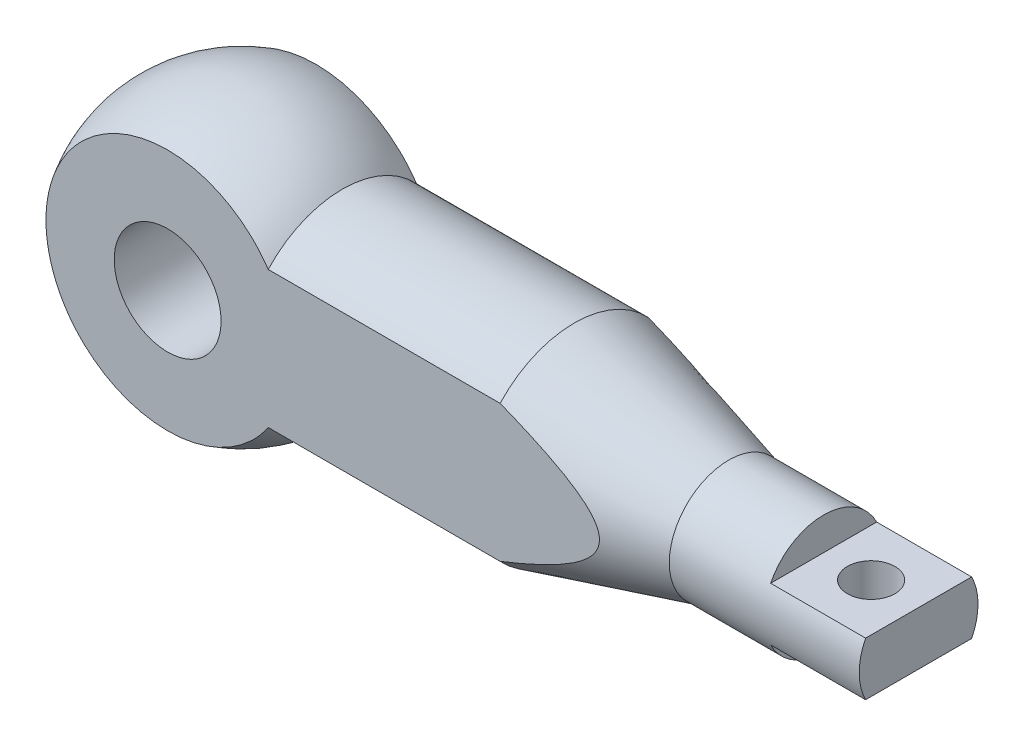
ISO-10303-21;
HEADER;
FILE_DESCRIPTION(('STEP AP214'),'2;1');
FILE_NAME('part.step','',(''),(''),'','','');
FILE_SCHEMA(('AUTOMOTIVE_DESIGN { 1 0 10303 214 1 1 1 1 }'));
ENDSEC;
DATA;
#1=APPLICATION_CONTEXT('core data for automotive mechanical design processes');
#2=APPLICATION_PROTOCOL_DEFINITION('international standard','automotive_design',2000,#1);
#3=PRODUCT_CONTEXT('',#1,'mechanical');
#4=PRODUCT('Part','Part','',(#3));
#5=PRODUCT_RELATED_PRODUCT_CATEGORY('part','',(#4));
#6=PRODUCT_DEFINITION_FORMATION('','',#4);
#7=PRODUCT_DEFINITION_CONTEXT('part definition',#1,'design');
#8=PRODUCT_DEFINITION('design','',#6,#7);
#9=PRODUCT_DEFINITION_SHAPE('','',#8);
#10=(LENGTH_UNIT() NAMED_UNIT(*) SI_UNIT(.MILLI.,.METRE.));
#11=(NAMED_UNIT(*) PLANE_ANGLE_UNIT() SI_UNIT($,.RADIAN.));
#12=(NAMED_UNIT(*) SI_UNIT($,.STERADIAN.) SOLID_ANGLE_UNIT());
#13=UNCERTAINTY_MEASURE_WITH_UNIT(LENGTH_MEASURE(1.E-05),#10,'distance_accuracy_value','');
#14=(GEOMETRIC_REPRESENTATION_CONTEXT(3) GLOBAL_UNCERTAINTY_ASSIGNED_CONTEXT((#13)) GLOBAL_UNIT_ASSIGNED_CONTEXT((#10,
#11,#12)) REPRESENTATION_CONTEXT('',''));
#15=CARTESIAN_POINT('',(0.,0.,0.));
#16=DIRECTION('',(0.,0.,1.));
#17=DIRECTION('',(1.,0.,0.));
#18=AXIS2_PLACEMENT_3D('',#15,#16,#17);
#19=CARTESIAN_POINT('',(-38.1,0.,0.));
#20=DIRECTION('',(-1.,0.,0.));
#21=DIRECTION('',(0.,0.,1.));
#22=AXIS2_PLACEMENT_3D('',#19,#20,#21);
#23=CYLINDRICAL_SURFACE('',#22,26.9875);
#24=CARTESIAN_POINT('',(88.9,0.,0.));
#25=DIRECTION('',(-1.,0.,0.));
#26=DIRECTION('',(0.,0.,1.));
#27=AXIS2_PLACEMENT_3D('',#24,#25,#26);
#28=CIRCLE('',#27,26.9875);
#29=CARTESIAN_POINT('',(88.9,-18.2976150765612,-19.8374));
#30=VERTEX_POINT('',#29);
#31=CARTESIAN_POINT('',(88.9,-18.2976150765612,19.8374));
#32=VERTEX_POINT('',#31);
#33=EDGE_CURVE('E183',#30,#32,#28,.T.);
#34=ORIENTED_EDGE('',*,*,#33,.T.);
#35=DIRECTION('',(-1.,0.,0.));
#36=VECTOR('',#35,1.);
#37=CARTESIAN_POINT('',(-38.1,-18.2976150765612,19.8374));
#38=LINE('',#37,#36);
#39=CARTESIAN_POINT('',(26.8939555244297,-18.2976150765612,19.8374));
#40=VERTEX_POINT('',#39);
#41=EDGE_CURVE('E168',#32,#40,#38,.T.);
#42=ORIENTED_EDGE('',*,*,#41,.T.);
#43=CARTESIAN_POINT('',(26.8939555244297,0.,0.));
#44=DIRECTION('',(-1.,0.,0.));
#45=DIRECTION('',(0.,0.,1.));
#46=AXIS2_PLACEMENT_3D('',#43,#44,#45);
#47=CIRCLE('',#46,26.9875);
#48=CARTESIAN_POINT('',(26.8939555244297,-18.2976150765612,-19.8374));
#49=VERTEX_POINT('',#48);
#50=EDGE_CURVE('E188',#49,#40,#47,.T.);
#51=ORIENTED_EDGE('',*,*,#50,.F.);
#52=DIRECTION('',(-1.,0.,0.));
#53=VECTOR('',#52,1.);
#54=CARTESIAN_POINT('',(-38.1,-18.2976150765612,-19.8374));
#55=LINE('',#54,#53);
#56=EDGE_CURVE('E134',#49,#30,#55,.F.);
#57=ORIENTED_EDGE('',*,*,#56,.T.);
#58=EDGE_LOOP('',(#34,#42,#51,#57));
#59=FACE_BOUND('',#58,.T.);
#60=ADVANCED_FACE('F39',(#59),#23,.T.);
#61=CARTESIAN_POINT('',(0.,0.,0.));
#62=DIRECTION('',(-1.,0.,0.));
#63=DIRECTION('',(0.,1.,0.));
#64=AXIS2_PLACEMENT_3D('',#61,#62,#63);
#65=SPHERICAL_SURFACE('',#64,38.1);
#66=CARTESIAN_POINT('',(0.,0.,19.8374));
#67=DIRECTION('',(0.,0.,-1.));
#68=DIRECTION('',(-1.,0.,0.));
#69=AXIS2_PLACEMENT_3D('',#66,#67,#68);
#70=CIRCLE('',#69,32.5282578881809);
#71=CARTESIAN_POINT('',(26.8939555244297,18.2976150765612,19.8374));
#72=VERTEX_POINT('',#71);
#73=EDGE_CURVE('E172',#40,#72,#70,.T.);
#74=ORIENTED_EDGE('',*,*,#73,.T.);
#75=CARTESIAN_POINT('',(26.8939555244297,18.2976150765612,-19.8374));
#76=VERTEX_POINT('',#75);
#77=EDGE_CURVE('E189',#72,#76,#47,.T.);
#78=ORIENTED_EDGE('',*,*,#77,.T.);
#79=CARTESIAN_POINT('',(0.,0.,-19.8374));
#80=DIRECTION('',(0.,0.,1.));
#81=DIRECTION('',(1.,0.,0.));
#82=AXIS2_PLACEMENT_3D('',#79,#80,#81);
#83=CIRCLE('',#82,32.5282578881809);
#84=EDGE_CURVE('E161',#76,#49,#83,.T.);
#85=ORIENTED_EDGE('',*,*,#84,.T.);
#86=ORIENTED_EDGE('',*,*,#50,.T.);
#87=EDGE_LOOP('',(#74,#78,#85,#86));
#88=FACE_BOUND('',#87,.T.);
#89=ADVANCED_FACE('F41',(#88),#65,.T.);
#90=ORIENTED_EDGE('',*,*,#77,.F.);
#91=DIRECTION('',(-1.,0.,0.));
#92=VECTOR('',#91,1.);
#93=CARTESIAN_POINT('',(-38.1,18.2976150765612,19.8374));
#94=LINE('',#93,#92);
#95=CARTESIAN_POINT('',(88.9,18.2976150765612,19.8374));
#96=VERTEX_POINT('',#95);
#97=EDGE_CURVE('E164',#72,#96,#94,.F.);
#98=ORIENTED_EDGE('',*,*,#97,.T.);
#99=CARTESIAN_POINT('',(88.9,18.2976150765612,-19.8374));
#100=VERTEX_POINT('',#99);
#101=EDGE_CURVE('E184',#96,#100,#28,.T.);
#102=ORIENTED_EDGE('',*,*,#101,.T.);
#103=DIRECTION('',(-1.,0.,0.));
#104=VECTOR('',#103,1.);
#105=CARTESIAN_POINT('',(-38.1,18.2976150765612,-19.8374));
#106=LINE('',#105,#104);
#107=EDGE_CURVE('E157',#100,#76,#106,.T.);
#108=ORIENTED_EDGE('',*,*,#107,.T.);
#109=EDGE_LOOP('',(#90,#98,#102,#108));
#110=FACE_BOUND('',#109,.T.);
#111=ADVANCED_FACE('F217',(#110),#23,.T.);
#112=CARTESIAN_POINT('',(130.175,0.,0.));
#113=DIRECTION('',(-1.,0.,0.));
#114=DIRECTION('',(0.,0.,1.));
#115=AXIS2_PLACEMENT_3D('',#112,#113,#114);
#116=CONICAL_SURFACE('',#115,15.875,0.26299473168092);
#117=ORIENTED_EDGE('',*,*,#101,.F.);
#118=CARTESIAN_POINT('',(20.9518327750712,40.7046436583915,19.8374));
#119=CARTESIAN_POINT('',(22.3822880112033,40.2762160310541,19.8374));
#120=CARTESIAN_POINT('',(23.8123887931812,39.8466054794505,19.8374));
#121=CARTESIAN_POINT('',(26.6718018677787,38.9847624838146,19.8374));
#122=CARTESIAN_POINT('',(28.1011141594613,38.5525300366742,19.8374));
#123=CARTESIAN_POINT('',(32.3878389375732,37.2514884503511,19.8374));
#124=CARTESIAN_POINT('',(35.2439441136354,36.3783635458465,19.8374));
#125=CARTESIAN_POINT('',(40.9559089761251,34.6166918853066,19.8374));
#126=CARTESIAN_POINT('',(43.8117623674174,33.728124703073,19.8374));
#127=CARTESIAN_POINT('',(49.5178336787221,31.933227844021,19.8374));
#128=CARTESIAN_POINT('',(52.3680517117119,31.0268985273545,19.8374));
#129=CARTESIAN_POINT('',(56.6450532283822,29.6479207090746,19.8374));
#130=CARTESIAN_POINT('',(58.0745945949615,29.183822937244,19.8374));
#131=CARTESIAN_POINT('',(60.9315001616513,28.2489775998761,19.8374));
#132=CARTESIAN_POINT('',(62.3588643663401,27.7782300483437,19.8374));
#133=CARTESIAN_POINT('',(65.2111284592841,26.8290296886149,19.8374));
#134=CARTESIAN_POINT('',(66.6360281899997,26.3505764066292,19.8374));
#135=CARTESIAN_POINT('',(69.4827892447898,25.3847151008392,19.8374));
#136=CARTESIAN_POINT('',(70.9046505759012,24.8973070977991,19.8374));
#137=CARTESIAN_POINT('',(73.7437370242878,23.9122704037833,19.8374));
#138=CARTESIAN_POINT('',(75.1609646587278,23.4146489773006,19.8374));
#139=CARTESIAN_POINT('',(77.9909598490674,22.4068092031187,19.8374));
#140=CARTESIAN_POINT('',(79.4037273565995,21.8965907193373,19.8374));
#141=CARTESIAN_POINT('',(82.2235099154354,20.8609400991814,19.8374));
#142=CARTESIAN_POINT('',(83.6305255757507,20.3355096237196,19.8374));
#143=CARTESIAN_POINT('',(86.4373705307564,19.2658304234761,19.8374));
#144=CARTESIAN_POINT('',(87.8372000441684,18.7215822753864,19.8374));
#145=CARTESIAN_POINT('',(89.9278190204788,17.88812143813,19.8374));
#146=CARTESIAN_POINT('',(90.6221825553122,17.6078668578627,19.8374));
#147=CARTESIAN_POINT('',(92.0081510283666,17.0405947158042,19.8374));
#148=CARTESIAN_POINT('',(92.6997559502168,16.7535771139479,19.8374));
#149=CARTESIAN_POINT('',(94.0799498527835,16.1717078330046,19.8374));
#150=CARTESIAN_POINT('',(94.7685377024964,15.8768534674391,19.8374));
#151=CARTESIAN_POINT('',(96.1418161088143,15.2782017153465,19.8374));
#152=CARTESIAN_POINT('',(96.826506694606,14.9744043958988,19.8374));
#153=CARTESIAN_POINT('',(98.1938912775238,14.3551270188827,19.8374));
#154=CARTESIAN_POINT('',(98.8765663791201,14.0396051479511,19.8374));
#155=CARTESIAN_POINT('',(100.236017767167,13.3961030382249,19.8374));
#156=CARTESIAN_POINT('',(100.912794200033,13.0681231097489,19.8374));
#157=CARTESIAN_POINT('',(102.258503164716,12.3973843563824,19.8374));
#158=CARTESIAN_POINT('',(102.92744010756,12.0546344054992,19.8374));
#159=CARTESIAN_POINT('',(104.255631907569,11.3508835683801,19.8374));
#160=CARTESIAN_POINT('',(104.914887756313,10.9898845683563,19.8374));
#161=CARTESIAN_POINT('',(105.896696575484,10.4296996364759,19.8374));
#162=CARTESIAN_POINT('',(106.224117160575,10.2390347238098,19.8374));
#163=CARTESIAN_POINT('',(106.875026806324,9.85111878468872,19.8374));
#164=CARTESIAN_POINT('',(107.198516022473,9.65386801987319,19.8374));
#165=CARTESIAN_POINT('',(107.841157678914,9.25166146325215,19.8374));
#166=CARTESIAN_POINT('',(108.160305150583,9.04669771389709,19.8374));
#167=CARTESIAN_POINT('',(108.792911291157,8.62816674400731,19.8374));
#168=CARTESIAN_POINT('',(109.106370148381,8.4145998090324,19.8374));
#169=CARTESIAN_POINT('',(109.7244851588,7.97879171290199,19.8374));
#170=CARTESIAN_POINT('',(110.029182056226,7.7566085520379,19.8374));
#171=CARTESIAN_POINT('',(110.629979198493,7.30074581685586,19.8374));
#172=CARTESIAN_POINT('',(110.92607796426,7.06706428296738,19.8374));
#173=CARTESIAN_POINT('',(111.506677233505,6.5866913533558,19.8374));
#174=CARTESIAN_POINT('',(111.791197876466,6.34002442470364,19.8374));
#175=CARTESIAN_POINT('',(112.345724591642,5.83097581756915,19.8374));
#176=CARTESIAN_POINT('',(112.615737825322,5.56860203043555,19.8374));
#177=CARTESIAN_POINT('',(113.053064261418,5.11218118633582,19.8374));
#178=CARTESIAN_POINT('',(113.225590788249,4.92313854145986,19.8374));
#179=CARTESIAN_POINT('',(113.55958306207,4.53539378464231,19.8374));
#180=CARTESIAN_POINT('',(113.72104655152,4.33668971523457,19.8374));
#181=CARTESIAN_POINT('',(114.029863463302,3.92901538589182,19.8374));
#182=CARTESIAN_POINT('',(114.17723986594,3.72006271741352,19.8374));
#183=CARTESIAN_POINT('',(114.45455992483,3.29102132050036,19.8374));
#184=CARTESIAN_POINT('',(114.584512188324,3.0709381648941,19.8374));
#185=CARTESIAN_POINT('',(114.863050014605,2.54258518506156,19.8374));
#186=CARTESIAN_POINT('',(115.003116649769,2.22962583138946,19.8374));
#187=CARTESIAN_POINT('',(115.174803276515,1.74680983308027,19.8374));
#188=CARTESIAN_POINT('',(115.225624690688,1.5836698107821,19.8374));
#189=CARTESIAN_POINT('',(115.313051723041,1.25365485149207,19.8374));
#190=CARTESIAN_POINT('',(115.349664640409,1.08678187891658,19.8374));
#191=CARTESIAN_POINT('',(115.40774906627,0.748697771908152,19.8374));
#192=CARTESIAN_POINT('',(115.429066893863,0.577460032370433,19.8374));
#193=CARTESIAN_POINT('',(115.455163649635,0.233723006787659,19.8374));
#194=CARTESIAN_POINT('',(115.459943325702,0.0612237781432779,19.8374));
#195=CARTESIAN_POINT('',(115.452773544956,-0.283453574307633,19.8374));
#196=CARTESIAN_POINT('',(115.440821229403,-0.45563163820848,19.8374));
#197=CARTESIAN_POINT('',(115.400652381859,-0.798072000406961,19.8374));
#198=CARTESIAN_POINT('',(115.372434350261,-0.968334120589447,19.8374));
#199=CARTESIAN_POINT('',(115.297929932552,-1.31888334059212,19.8374));
#200=CARTESIAN_POINT('',(115.250396003252,-1.49890444002497,19.8374));
#201=CARTESIAN_POINT('',(115.13934479418,-1.85399121944886,19.8374));
#202=CARTESIAN_POINT('',(115.075817272016,-2.02905364364299,19.8374));
#203=CARTESIAN_POINT('',(114.864066083077,-2.54594432502753,19.8374));
#204=CARTESIAN_POINT('',(114.694733789092,-2.87921648919213,19.8374));
#205=CARTESIAN_POINT('',(114.346061393135,-3.46877961594786,19.8374));
#206=CARTESIAN_POINT('',(114.172774857833,-3.7288006997069,19.8374));
#207=CARTESIAN_POINT('',(113.80427609307,-4.23302867430933,19.8374));
#208=CARTESIAN_POINT('',(113.609046919094,-4.47722311090607,19.8374));
#209=CARTESIAN_POINT('',(113.201497280748,-4.95181161569931,19.8374));
#210=CARTESIAN_POINT('',(112.989134718279,-5.18216910618381,19.8374));
#211=CARTESIAN_POINT('',(112.551619436085,-5.63014349050873,19.8374));
#212=CARTESIAN_POINT('',(112.326471179238,-5.8477647767478,19.8374));
#213=CARTESIAN_POINT('',(111.722142289409,-6.40472561891557,19.8374));
#214=CARTESIAN_POINT('',(111.334690246883,-6.7350714571458,19.8374));
#215=CARTESIAN_POINT('',(110.541149641254,-7.37272532117826,19.8374));
#216=CARTESIAN_POINT('',(110.135049612527,-7.680018859164,19.8374));
#217=CARTESIAN_POINT('',(109.308459107725,-8.27644955811056,19.8374));
#218=CARTESIAN_POINT('',(108.88793922125,-8.56554572540175,19.8374));
#219=CARTESIAN_POINT('',(108.036799729361,-9.12815109005102,19.8374));
#220=CARTESIAN_POINT('',(107.606182453688,-9.40166383393517,19.8374));
#221=CARTESIAN_POINT('',(106.734344856009,-9.93740659189574,19.8374));
#222=CARTESIAN_POINT('',(106.293075437358,-10.1995563878037,19.8374));
#223=CARTESIAN_POINT('',(105.404153101481,-10.7128126123674,19.8374));
#224=CARTESIAN_POINT('',(104.956499869179,-10.9639184934303,19.8374));
#225=CARTESIAN_POINT('',(104.056666480746,-11.4563351931817,19.8374));
#226=CARTESIAN_POINT('',(103.6044935453,-11.6976592415829,19.8374));
#227=CARTESIAN_POINT('',(102.695921406812,-12.1721539141663,19.8374));
#228=CARTESIAN_POINT('',(102.23952236389,-12.4053248456702,19.8374));
#229=CARTESIAN_POINT('',(101.240457770138,-12.9060200263773,19.8374));
#230=CARTESIAN_POINT('',(100.697092733259,-13.1721469977345,19.8374));
#231=CARTESIAN_POINT('',(99.6062715511252,-13.6958975581221,19.8374));
#232=CARTESIAN_POINT('',(99.058815293497,-13.9535209125222,19.8374));
#233=CARTESIAN_POINT('',(97.960425046685,-14.4614002609191,19.8374));
#234=CARTESIAN_POINT('',(97.4094906683158,-14.7116554120458,19.8374));
#235=CARTESIAN_POINT('',(96.3047164620008,-15.20567519761,19.8374));
#236=CARTESIAN_POINT('',(95.7508765958892,-15.4494397465317,19.8374));
#237=CARTESIAN_POINT('',(94.0851167772876,-16.1723878301356,19.8374));
#238=CARTESIAN_POINT('',(92.9694692441626,-16.6429906546282,19.8374));
#239=CARTESIAN_POINT('',(90.7307723006555,-17.5659678716515,19.8374));
#240=CARTESIAN_POINT('',(89.6077233066751,-18.01834327963,19.8374));
#241=CARTESIAN_POINT('',(87.3535381781714,-18.909133034052,19.8374));
#242=CARTESIAN_POINT('',(86.2223904242631,-19.3475179223098,19.8374));
#243=CARTESIAN_POINT('',(83.9553802743491,-20.2119374731611,19.8374));
#244=CARTESIAN_POINT('',(82.8195178205204,-20.63797198377,19.8374));
#245=CARTESIAN_POINT('',(80.5442620681217,-21.4795260158719,19.8374));
#246=CARTESIAN_POINT('',(79.4048698165167,-21.8950483722157,19.8374));
#247=CARTESIAN_POINT('',(77.1229023640993,-22.7172319737388,19.8374));
#248=CARTESIAN_POINT('',(75.9803271768636,-23.1238932566495,19.8374));
#249=CARTESIAN_POINT('',(73.6952782665065,-23.928605005331,19.8374));
#250=CARTESIAN_POINT('',(72.5528110726078,-24.3266740293214,19.8374));
#251=CARTESIAN_POINT('',(70.265596927264,-25.1162023568016,19.8374));
#252=CARTESIAN_POINT('',(69.1208499744986,-25.5076616564622,19.8374));
#253=CARTESIAN_POINT('',(65.6835347730332,-26.6734325448362,19.8374));
#254=CARTESIAN_POINT('',(63.3880297033256,-27.4390889323985,19.8374));
#255=CARTESIAN_POINT('',(58.7932728800853,-28.951613734197,19.8374));
#256=CARTESIAN_POINT('',(56.4940267533974,-29.6984992970269,19.8374));
#257=CARTESIAN_POINT('',(51.8908723820074,-31.1777750778548,19.8374));
#258=CARTESIAN_POINT('',(49.5869641209622,-31.9101652449421,19.8374));
#259=CARTESIAN_POINT('',(45.0919063358464,-33.3263900824596,19.8374));
#260=CARTESIAN_POINT('',(42.9009404757534,-34.010808510672,19.8374));
#261=CARTESIAN_POINT('',(38.5157624890983,-35.3708305608946,19.8374));
#262=CARTESIAN_POINT('',(36.3215497681468,-36.0464322650908,19.8374));
#263=CARTESIAN_POINT('',(31.9322991572362,-37.389592553908,19.8374));
#264=CARTESIAN_POINT('',(29.7372628452889,-38.0571562997385,19.8374));
#265=CARTESIAN_POINT('',(25.3457007673797,-39.3856071659004,19.8374));
#266=CARTESIAN_POINT('',(23.1491754388909,-40.0464957320033,19.8374));
#267=CARTESIAN_POINT('',(20.9518327750712,-40.7046436583915,19.8374));
#268=B_SPLINE_CURVE_WITH_KNOTS('',3,(#118,#119,#120,#121,#122,#123,#124,#125,#126,#127,#128,
#129,#130,#131,#132,#133,#134,#135,#136,#137,#138,#139,#140,#141,#142,#143,#144,#145,#146,#147,
#148,#149,#150,#151,#152,#153,#154,#155,#156,#157,#158,#159,#160,#161,#162,#163,#164,#165,#166,
#167,#168,#169,#170,#171,#172,#173,#174,#175,#176,#177,#178,#179,#180,#181,#182,#183,#184,#185,
#186,#187,#188,#189,#190,#191,#192,#193,#194,#195,#196,#197,#198,#199,#200,#201,#202,#203,#204,
#205,#206,#207,#208,#209,#210,#211,#212,#213,#214,#215,#216,#217,#218,#219,#220,#221,#222,#223,
#224,#225,#226,#227,#228,#229,#230,#231,#232,#233,#234,#235,#236,#237,#238,#239,#240,#241,#242,
#243,#244,#245,#246,#247,#248,#249,#250,#251,#252,#253,#254,#255,#256,#257,#258,#259,#260,#261,
#262,#263,#264,#265,#266,#267),.UNSPECIFIED.,.F.,.F.,(4,2,2,2,2,2,2,2,2,2,2,2,2,2,2,2,2,2,2,2,2,
2,2,2,2,2,2,2,2,2,2,2,2,2,2,2,2,2,2,2,2,2,2,2,2,2,2,2,2,2,2,2,2,2,2,2,2,2,2,2,2,2,2,2,2,2,2,2,2,
2,2,2,2,2,4),(0.,4.47970556078827,8.95941643306253,17.9191363202256,26.8917785071571,
35.864238949195,40.3731923541673,44.8821362643757,49.3913584749008,53.9005702308139,
58.4066788425654,62.912836153808,67.4185033046255,71.9240324955577,74.1703679090831,
76.4167166335288,78.6638456098343,80.9109577351363,83.1670445089677,85.4230751225682,
87.6777686852286,89.9322296785276,91.0688367857615,92.2053987920277,93.3431674026938,
94.4808982792329,95.6119787996814,96.7432527527954,97.8724665568785,99.0011177132891,
99.7685790825947,100.536196597714,101.302539725032,102.068502885522,103.093037268691,
103.605134787763,104.116968882797,104.633876345729,105.150760432734,105.667732842602,
106.184752922077,106.742475285016,107.300555729305,108.417505385936,109.353709965944,
110.290642533174,111.229951752686,112.168935095457,113.695153399041,115.222322994995,
116.752818090829,118.28296346875,119.822569818768,121.362252421553,122.899777979599,
124.43724551993,126.252265584101,128.067335686165,129.882612618933,131.697913456728,
135.330206767475,138.962297442905,142.601589293076,146.240925909613,149.87927039919,
153.517599393252,157.147067922385,160.776538554033,168.03591695874,175.288402713245,
182.540913935405,189.427025963687,196.314611696935,203.197509727571,210.078883572505),.UNSPECIFIED.);
#269=EDGE_CURVE('E11',#96,#32,#268,.T.);
#270=ORIENTED_EDGE('',*,*,#269,.T.);
#271=ORIENTED_EDGE('',*,*,#33,.F.);
#272=CARTESIAN_POINT('',(20.9518327750712,-40.7046436583915,-19.8374));
#273=CARTESIAN_POINT('',(22.3822880112033,-40.2762160310541,-19.8374));
#274=CARTESIAN_POINT('',(23.8123887931812,-39.8466054794505,-19.8374));
#275=CARTESIAN_POINT('',(26.6718018677786,-38.9847624838146,-19.8374));
#276=CARTESIAN_POINT('',(28.1011141594613,-38.5525300366742,-19.8374));
#277=CARTESIAN_POINT('',(32.3878389375732,-37.2514884503511,-19.8374));
#278=CARTESIAN_POINT('',(35.2439441136354,-36.3783635458465,-19.8374));
#279=CARTESIAN_POINT('',(40.9559089761251,-34.6166918853066,-19.8374));
#280=CARTESIAN_POINT('',(43.8117623674174,-33.728124703073,-19.8374));
#281=CARTESIAN_POINT('',(49.5178336787221,-31.933227844021,-19.8374));
#282=CARTESIAN_POINT('',(52.3680517117119,-31.0268985273545,-19.8374));
#283=CARTESIAN_POINT('',(56.6450532283822,-29.6479207090746,-19.8374));
#284=CARTESIAN_POINT('',(58.0745945949615,-29.183822937244,-19.8374));
#285=CARTESIAN_POINT('',(60.9315001616513,-28.2489775998761,-19.8374));
#286=CARTESIAN_POINT('',(62.35886436634,-27.7782300483437,-19.8374));
#287=CARTESIAN_POINT('',(65.2111284592841,-26.8290296886149,-19.8374));
#288=CARTESIAN_POINT('',(66.6360281899996,-26.3505764066292,-19.8374));
#289=CARTESIAN_POINT('',(69.4827892447897,-25.3847151008392,-19.8374));
#290=CARTESIAN_POINT('',(70.9046505759012,-24.8973070977991,-19.8374));
#291=CARTESIAN_POINT('',(73.7437370242878,-23.9122704037833,-19.8374));
#292=CARTESIAN_POINT('',(75.1609646587278,-23.4146489773006,-19.8374));
#293=CARTESIAN_POINT('',(77.9909598490674,-22.4068092031187,-19.8374));
#294=CARTESIAN_POINT('',(79.4037273565995,-21.8965907193373,-19.8374));
#295=CARTESIAN_POINT('',(82.2235099154354,-20.8609400991814,-19.8374));
#296=CARTESIAN_POINT('',(83.6305255757507,-20.3355096237196,-19.8374));
#297=CARTESIAN_POINT('',(86.4373705307564,-19.265830423476,-19.8374));
#298=CARTESIAN_POINT('',(87.8372000441684,-18.7215822753864,-19.8374));
#299=CARTESIAN_POINT('',(89.9278190204788,-17.88812143813,-19.8374));
#300=CARTESIAN_POINT('',(90.6221825553122,-17.6078668578627,-19.8374));
#301=CARTESIAN_POINT('',(92.0081510283666,-17.0405947158042,-19.8374));
#302=CARTESIAN_POINT('',(92.6997559502168,-16.7535771139479,-19.8374));
#303=CARTESIAN_POINT('',(94.0799498527835,-16.1717078330046,-19.8374));
#304=CARTESIAN_POINT('',(94.7685377024964,-15.8768534674391,-19.8374));
#305=CARTESIAN_POINT('',(96.1418161088143,-15.2782017153465,-19.8374));
#306=CARTESIAN_POINT('',(96.826506694606,-14.9744043958988,-19.8374));
#307=CARTESIAN_POINT('',(98.1938912775238,-14.3551270188827,-19.8374));
#308=CARTESIAN_POINT('',(98.8765663791201,-14.0396051479511,-19.8374));
#309=CARTESIAN_POINT('',(100.236017767167,-13.3961030382249,-19.8374));
#310=CARTESIAN_POINT('',(100.912794200033,-13.0681231097489,-19.8374));
#311=CARTESIAN_POINT('',(102.258503164716,-12.3973843563824,-19.8374));
#312=CARTESIAN_POINT('',(102.92744010756,-12.0546344054992,-19.8374));
#313=CARTESIAN_POINT('',(104.255631907569,-11.3508835683801,-19.8374));
#314=CARTESIAN_POINT('',(104.914887756313,-10.9898845683563,-19.8374));
#315=CARTESIAN_POINT('',(105.896696575484,-10.4296996364759,-19.8374));
#316=CARTESIAN_POINT('',(106.224117160575,-10.2390347238098,-19.8374));
#317=CARTESIAN_POINT('',(106.875026806324,-9.85111878468871,-19.8374));
#318=CARTESIAN_POINT('',(107.198516022473,-9.65386801987319,-19.8374));
#319=CARTESIAN_POINT('',(107.841157678914,-9.25166146325215,-19.8374));
#320=CARTESIAN_POINT('',(108.160305150583,-9.04669771389709,-19.8374));
#321=CARTESIAN_POINT('',(108.792911291157,-8.62816674400731,-19.8374));
#322=CARTESIAN_POINT('',(109.106370148381,-8.41459980903239,-19.8374));
#323=CARTESIAN_POINT('',(109.7244851588,-7.97879171290198,-19.8374));
#324=CARTESIAN_POINT('',(110.029182056226,-7.75660855203789,-19.8374));
#325=CARTESIAN_POINT('',(110.629979198493,-7.30074581685585,-19.8374));
#326=CARTESIAN_POINT('',(110.92607796426,-7.06706428296736,-19.8374));
#327=CARTESIAN_POINT('',(111.506677233505,-6.58669135335578,-19.8374));
#328=CARTESIAN_POINT('',(111.791197876466,-6.34002442470363,-19.8374));
#329=CARTESIAN_POINT('',(112.345724591642,-5.83097581756915,-19.8374));
#330=CARTESIAN_POINT('',(112.615737825322,-5.56860203043554,-19.8374));
#331=CARTESIAN_POINT('',(113.053064261418,-5.11218118633582,-19.8374));
#332=CARTESIAN_POINT('',(113.225590788249,-4.92313854145986,-19.8374));
#333=CARTESIAN_POINT('',(113.55958306207,-4.53539378464231,-19.8374));
#334=CARTESIAN_POINT('',(113.72104655152,-4.33668971523457,-19.8374));
#335=CARTESIAN_POINT('',(114.029863463302,-3.92901538589182,-19.8374));
#336=CARTESIAN_POINT('',(114.17723986594,-3.72006271741353,-19.8374));
#337=CARTESIAN_POINT('',(114.45455992483,-3.29102132050037,-19.8374));
#338=CARTESIAN_POINT('',(114.584512188324,-3.07093816489412,-19.8374));
#339=CARTESIAN_POINT('',(114.863050014605,-2.54258518506157,-19.8374));
#340=CARTESIAN_POINT('',(115.003116649769,-2.22962583138947,-19.8374));
#341=CARTESIAN_POINT('',(115.174803276515,-1.74680983308029,-19.8374));
#342=CARTESIAN_POINT('',(115.225624690688,-1.58366981078211,-19.8374));
#343=CARTESIAN_POINT('',(115.313051723041,-1.25365485149207,-19.8374));
#344=CARTESIAN_POINT('',(115.349664640409,-1.08678187891657,-19.8374));
#345=CARTESIAN_POINT('',(115.40774906627,-0.748697771908135,-19.8374));
#346=CARTESIAN_POINT('',(115.429066893863,-0.57746003237041,-19.8374));
#347=CARTESIAN_POINT('',(115.455163649634,-0.233723006787635,-19.8374));
#348=CARTESIAN_POINT('',(115.459943325702,-0.0612237781432581,-19.8374));
#349=CARTESIAN_POINT('',(115.452773544956,0.283453574307646,-19.8374));
#350=CARTESIAN_POINT('',(115.440821229403,0.45563163820849,-19.8374));
#351=CARTESIAN_POINT('',(115.400652381859,0.798072000406973,-19.8374));
#352=CARTESIAN_POINT('',(115.372434350261,0.968334120589463,-19.8374));
#353=CARTESIAN_POINT('',(115.297929932552,1.31888334059214,-19.8374));
#354=CARTESIAN_POINT('',(115.250396003251,1.498904440025,-19.8374));
#355=CARTESIAN_POINT('',(115.13934479418,1.85399121944889,-19.8374));
#356=CARTESIAN_POINT('',(115.075817272016,2.02905364364301,-19.8374));
#357=CARTESIAN_POINT('',(114.864066083077,2.54594432502756,-19.8374));
#358=CARTESIAN_POINT('',(114.694733789092,2.87921648919215,-19.8374));
#359=CARTESIAN_POINT('',(114.346061393135,3.46877961594789,-19.8374));
#360=CARTESIAN_POINT('',(114.172774857833,3.72880069970695,-19.8374));
#361=CARTESIAN_POINT('',(113.80427609307,4.23302867430938,-19.8374));
#362=CARTESIAN_POINT('',(113.609046919094,4.4772231109061,-19.8374));
#363=CARTESIAN_POINT('',(113.201497280748,4.95181161569933,-19.8374));
#364=CARTESIAN_POINT('',(112.989134718279,5.18216910618384,-19.8374));
#365=CARTESIAN_POINT('',(112.551619436085,5.63014349050877,-19.8374));
#366=CARTESIAN_POINT('',(112.326471179238,5.84776477674783,-19.8374));
#367=CARTESIAN_POINT('',(111.722142289409,6.40472561891561,-19.8374));
#368=CARTESIAN_POINT('',(111.334690246883,6.73507145714585,-19.8374));
#369=CARTESIAN_POINT('',(110.541149641254,7.37272532117831,-19.8374));
#370=CARTESIAN_POINT('',(110.135049612527,7.68001885916405,-19.8374));
#371=CARTESIAN_POINT('',(109.308459107725,8.2764495581106,-19.8374));
#372=CARTESIAN_POINT('',(108.88793922125,8.5655457254018,-19.8374));
#373=CARTESIAN_POINT('',(108.036799729361,9.12815109005107,-19.8374));
#374=CARTESIAN_POINT('',(107.606182453688,9.40166383393524,-19.8374));
#375=CARTESIAN_POINT('',(106.734344856009,9.9374065918958,-19.8374));
#376=CARTESIAN_POINT('',(106.293075437358,10.1995563878037,-19.8374));
#377=CARTESIAN_POINT('',(105.404153101481,10.7128126123674,-19.8374));
#378=CARTESIAN_POINT('',(104.956499869179,10.9639184934304,-19.8374));
#379=CARTESIAN_POINT('',(104.056666480746,11.4563351931818,-19.8374));
#380=CARTESIAN_POINT('',(103.6044935453,11.6976592415829,-19.8374));
#381=CARTESIAN_POINT('',(102.695921406812,12.1721539141664,-19.8374));
#382=CARTESIAN_POINT('',(102.23952236389,12.4053248456702,-19.8374));
#383=CARTESIAN_POINT('',(101.240457770138,12.9060200263774,-19.8374));
#384=CARTESIAN_POINT('',(100.697092733259,13.1721469977346,-19.8374));
#385=CARTESIAN_POINT('',(99.606271551125,13.6958975581222,-19.8374));
#386=CARTESIAN_POINT('',(99.0588152934967,13.9535209125223,-19.8374));
#387=CARTESIAN_POINT('',(97.9604250466847,14.4614002609192,-19.8374));
#388=CARTESIAN_POINT('',(97.4094906683156,14.7116554120459,-19.8374));
#389=CARTESIAN_POINT('',(96.3047164620005,15.2056751976101,-19.8374));
#390=CARTESIAN_POINT('',(95.7508765958889,15.4494397465318,-19.8374));
#391=CARTESIAN_POINT('',(94.0851167772873,16.1723878301357,-19.8374));
#392=CARTESIAN_POINT('',(92.9694692441623,16.6429906546283,-19.8374));
#393=CARTESIAN_POINT('',(90.7307723006551,17.5659678716516,-19.8374));
#394=CARTESIAN_POINT('',(89.6077233066747,18.0183432796301,-19.8374));
#395=CARTESIAN_POINT('',(87.353538178171,18.9091330340521,-19.8374));
#396=CARTESIAN_POINT('',(86.2223904242627,19.3475179223099,-19.8374));
#397=CARTESIAN_POINT('',(83.9553802743487,20.2119374731612,-19.8374));
#398=CARTESIAN_POINT('',(82.81951782052,20.6379719837701,-19.8374));
#399=CARTESIAN_POINT('',(80.5442620681212,21.4795260158721,-19.8374));
#400=CARTESIAN_POINT('',(79.4048698165162,21.8950483722159,-19.8374));
#401=CARTESIAN_POINT('',(77.1229023640988,22.7172319737389,-19.8374));
#402=CARTESIAN_POINT('',(75.9803271768631,23.1238932566496,-19.8374));
#403=CARTESIAN_POINT('',(73.6952782665059,23.9286050053311,-19.8374));
#404=CARTESIAN_POINT('',(72.5528110726072,24.3266740293216,-19.8374));
#405=CARTESIAN_POINT('',(70.2655969272634,25.1162023568018,-19.8374));
#406=CARTESIAN_POINT('',(69.120849974498,25.5076616564624,-19.8374));
#407=CARTESIAN_POINT('',(65.6835347730326,26.6734325448365,-19.8374));
#408=CARTESIAN_POINT('',(63.3880297033249,27.4390889323987,-19.8374));
#409=CARTESIAN_POINT('',(58.7932728800846,28.9516137341973,-19.8374));
#410=CARTESIAN_POINT('',(56.4940267533966,29.6984992970271,-19.8374));
#411=CARTESIAN_POINT('',(51.8908723820066,31.1777750778551,-19.8374));
#412=CARTESIAN_POINT('',(49.5869641209614,31.9101652449424,-19.8374));
#413=CARTESIAN_POINT('',(45.0919063358455,33.3263900824598,-19.8374));
#414=CARTESIAN_POINT('',(42.9009404757526,34.0108085106723,-19.8374));
#415=CARTESIAN_POINT('',(38.5157624890977,35.3708305608948,-19.8374));
#416=CARTESIAN_POINT('',(36.3215497681463,36.046432265091,-19.8374));
#417=CARTESIAN_POINT('',(31.9322991572358,37.3895925539081,-19.8374));
#418=CARTESIAN_POINT('',(29.7372628452886,38.0571562997386,-19.8374));
#419=CARTESIAN_POINT('',(25.3457007673796,39.3856071659004,-19.8374));
#420=CARTESIAN_POINT('',(23.1491754388908,40.0464957320033,-19.8374));
#421=CARTESIAN_POINT('',(20.9518327750712,40.7046436583915,-19.8374));
#422=B_SPLINE_CURVE_WITH_KNOTS('',3,(#272,#273,#274,#275,#276,#277,#278,#279,#280,#281,#282,
#283,#284,#285,#286,#287,#288,#289,#290,#291,#292,#293,#294,#295,#296,#297,#298,#299,#300,#301,
#302,#303,#304,#305,#306,#307,#308,#309,#310,#311,#312,#313,#314,#315,#316,#317,#318,#319,#320,
#321,#322,#323,#324,#325,#326,#327,#328,#329,#330,#331,#332,#333,#334,#335,#336,#337,#338,#339,
#340,#341,#342,#343,#344,#345,#346,#347,#348,#349,#350,#351,#352,#353,#354,#355,#356,#357,#358,
#359,#360,#361,#362,#363,#364,#365,#366,#367,#368,#369,#370,#371,#372,#373,#374,#375,#376,#377,
#378,#379,#380,#381,#382,#383,#384,#385,#386,#387,#388,#389,#390,#391,#392,#393,#394,#395,#396,
#397,#398,#399,#400,#401,#402,#403,#404,#405,#406,#407,#408,#409,#410,#411,#412,#413,#414,#415,
#416,#417,#418,#419,#420,#421),.UNSPECIFIED.,.F.,.F.,(4,2,2,2,2,2,2,2,2,2,2,2,2,2,2,2,2,2,2,2,2,
2,2,2,2,2,2,2,2,2,2,2,2,2,2,2,2,2,2,2,2,2,2,2,2,2,2,2,2,2,2,2,2,2,2,2,2,2,2,2,2,2,2,2,2,2,2,2,2,
2,2,2,2,2,4),(0.,4.47970556078826,8.95941643306252,17.9191363202256,26.891778507157,
35.8642389491949,40.3731923541673,44.8821362643756,49.3913584749008,53.9005702308139,
58.4066788425654,62.912836153808,67.4185033046256,71.9240324955577,74.1703679090831,
76.4167166335288,78.6638456098343,80.9109577351363,83.1670445089677,85.4230751225682,
87.6777686852286,89.9322296785276,91.0688367857615,92.2053987920277,93.3431674026938,
94.4808982792329,95.6119787996814,96.7432527527954,97.8724665568786,99.0011177132891,
99.7685790825947,100.536196597714,101.302539725032,102.068502885522,103.093037268691,
103.605134787763,104.116968882797,104.633876345729,105.150760432734,105.667732842602,
106.184752922077,106.742475285016,107.300555729305,108.417505385936,109.353709965944,
110.290642533174,111.229951752686,112.168935095457,113.695153399042,115.222322994995,
116.752818090829,118.28296346875,119.822569818768,121.362252421553,122.899777979599,
124.43724551993,126.252265584101,128.067335686165,129.882612618933,131.697913456728,
135.330206767475,138.962297442905,142.601589293076,146.240925909613,149.87927039919,
153.517599393253,157.147067922386,160.776538554034,168.035916958741,175.288402713246,
182.540913935406,189.427025963687,196.314611696936,203.197509727571,210.078883572505),.UNSPECIFIED.);
#423=EDGE_CURVE('E54',#30,#100,#422,.T.);
#424=ORIENTED_EDGE('',*,*,#423,.T.);
#425=EDGE_LOOP('',(#117,#270,#271,#424));
#426=FACE_BOUND('',#425,.T.);
#427=CARTESIAN_POINT('',(130.175,0.,0.));
#428=DIRECTION('',(-1.,0.,0.));
#429=DIRECTION('',(0.,0.,1.));
#430=AXIS2_PLACEMENT_3D('',#427,#428,#429);
#431=CIRCLE('',#430,15.875);
#432=CARTESIAN_POINT('',(130.175,0.,15.875));
#433=VERTEX_POINT('',#432);
#434=EDGE_CURVE('E179',#433,#433,#431,.T.);
#435=ORIENTED_EDGE('',*,*,#434,.T.);
#436=EDGE_LOOP('',(#435));
#437=FACE_BOUND('',#436,.T.);
#438=ADVANCED_FACE('F199',(#426,#437),#116,.T.);
#439=CARTESIAN_POINT('',(-38.1,0.,0.));
#440=DIRECTION('',(-1.,0.,0.));
#441=DIRECTION('',(0.,0.,1.));
#442=AXIS2_PLACEMENT_3D('',#439,#440,#441);
#443=CYLINDRICAL_SURFACE('',#442,15.875);
#444=CARTESIAN_POINT('',(180.975,0.,0.));
#445=DIRECTION('',(-1.,0.,0.));
#446=DIRECTION('',(0.,0.,1.));
#447=AXIS2_PLACEMENT_3D('',#444,#445,#446);
#448=CIRCLE('',#447,15.875);
#449=CARTESIAN_POINT('',(180.975,7.1374,-14.1800263130927));
#450=VERTEX_POINT('',#449);
#451=CARTESIAN_POINT('',(180.975,-7.1374,-14.1800263130927));
#452=VERTEX_POINT('',#451);
#453=EDGE_CURVE('E130',#450,#452,#448,.T.);
#454=ORIENTED_EDGE('',*,*,#453,.T.);
#455=DIRECTION('',(1.,0.,0.));
#456=VECTOR('',#455,1.);
#457=CARTESIAN_POINT('',(155.575,-7.1374,-14.1800263130927));
#458=LINE('',#457,#456);
#459=CARTESIAN_POINT('',(155.575,-7.1374,-14.1800263130927));
#460=VERTEX_POINT('',#459);
#461=EDGE_CURVE('E61',#460,#452,#458,.T.);
#462=ORIENTED_EDGE('',*,*,#461,.F.);
#463=CARTESIAN_POINT('',(155.575,0.,0.));
#464=DIRECTION('',(1.,0.,0.));
#465=DIRECTION('',(0.,0.,-1.));
#466=AXIS2_PLACEMENT_3D('',#463,#464,#465);
#467=CIRCLE('',#466,15.875);
#468=CARTESIAN_POINT('',(155.575,-7.1374,14.1800263130927));
#469=VERTEX_POINT('',#468);
#470=EDGE_CURVE('E113',#469,#460,#467,.T.);
#471=ORIENTED_EDGE('',*,*,#470,.F.);
#472=DIRECTION('',(1.,0.,0.));
#473=VECTOR('',#472,1.);
#474=CARTESIAN_POINT('',(155.575,-7.1374,14.1800263130927));
#475=LINE('',#474,#473);
#476=CARTESIAN_POINT('',(180.975,-7.1374,14.1800263130927));
#477=VERTEX_POINT('',#476);
#478=EDGE_CURVE('E122',#469,#477,#475,.T.);
#479=ORIENTED_EDGE('',*,*,#478,.T.);
#480=CARTESIAN_POINT('',(180.975,7.1374,14.1800263130927));
#481=VERTEX_POINT('',#480);
#482=EDGE_CURVE('E175',#477,#481,#448,.T.);
#483=ORIENTED_EDGE('',*,*,#482,.T.);
#484=DIRECTION('',(1.,0.,0.));
#485=VECTOR('',#484,1.);
#486=CARTESIAN_POINT('',(155.575,7.1374,14.1800263130927));
#487=LINE('',#486,#485);
#488=CARTESIAN_POINT('',(155.575,7.1374,14.1800263130927));
#489=VERTEX_POINT('',#488);
#490=EDGE_CURVE('E69',#489,#481,#487,.T.);
#491=ORIENTED_EDGE('',*,*,#490,.F.);
#492=CARTESIAN_POINT('',(155.575,0.,0.));
#493=DIRECTION('',(1.,0.,0.));
#494=DIRECTION('',(0.,0.,-1.));
#495=AXIS2_PLACEMENT_3D('',#492,#493,#494);
#496=CIRCLE('',#495,15.875);
#497=CARTESIAN_POINT('',(155.575,7.1374,-14.1800263130927));
#498=VERTEX_POINT('',#497);
#499=EDGE_CURVE('E138',#498,#489,#496,.T.);
#500=ORIENTED_EDGE('',*,*,#499,.F.);
#501=DIRECTION('',(1.,0.,0.));
#502=VECTOR('',#501,1.);
#503=CARTESIAN_POINT('',(155.575,7.1374,-14.1800263130927));
#504=LINE('',#503,#502);
#505=EDGE_CURVE('E149',#498,#450,#504,.T.);
#506=ORIENTED_EDGE('',*,*,#505,.T.);
#507=EDGE_LOOP('',(#454,#462,#471,#479,#483,#491,#500,#506));
#508=FACE_BOUND('',#507,.T.);
#509=ORIENTED_EDGE('',*,*,#434,.F.);
#510=EDGE_LOOP('',(#509));
#511=FACE_BOUND('',#510,.T.);
#512=ADVANCED_FACE('F126',(#508,#511),#443,.T.);
#513=CARTESIAN_POINT('',(180.975,0.,0.));
#514=DIRECTION('',(-1.,0.,0.));
#515=DIRECTION('',(0.,0.,1.));
#516=AXIS2_PLACEMENT_3D('',#513,#514,#515);
#517=PLANE('',#516);
#518=ORIENTED_EDGE('',*,*,#482,.F.);
#519=DIRECTION('',(0.,0.,1.));
#520=VECTOR('',#519,1.);
#521=CARTESIAN_POINT('',(180.975,-7.1374,14.1800263130927));
#522=LINE('',#521,#520);
#523=EDGE_CURVE('E119',#452,#477,#522,.T.);
#524=ORIENTED_EDGE('',*,*,#523,.F.);
#525=ORIENTED_EDGE('',*,*,#453,.F.);
#526=DIRECTION('',(0.,0.,-1.));
#527=VECTOR('',#526,1.);
#528=CARTESIAN_POINT('',(180.975,7.1374,14.1800263130927));
#529=LINE('',#528,#527);
#530=EDGE_CURVE('E142',#481,#450,#529,.T.);
#531=ORIENTED_EDGE('',*,*,#530,.F.);
#532=EDGE_LOOP('',(#518,#524,#525,#531));
#533=FACE_BOUND('',#532,.T.);
#534=ADVANCED_FACE('F207',(#533),#517,.F.);
#535=CARTESIAN_POINT('',(-38.1,32.5282578881809,-19.8374));
#536=DIRECTION('',(0.,0.,1.));
#537=DIRECTION('',(1.,0.,0.));
#538=AXIS2_PLACEMENT_3D('',#535,#536,#537);
#539=PLANE('',#538);
#540=CARTESIAN_POINT('',(0.,0.,-19.8374));
#541=DIRECTION('',(0.,0.,1.));
#542=DIRECTION('',(1.,0.,0.));
#543=AXIS2_PLACEMENT_3D('',#540,#541,#542);
#544=CIRCLE('',#543,14.2875);
#545=CARTESIAN_POINT('',(14.2875,0.,-19.8374));
#546=VERTEX_POINT('',#545);
#547=EDGE_CURVE('E257',#546,#546,#544,.F.);
#548=ORIENTED_EDGE('',*,*,#547,.F.);
#549=EDGE_LOOP('',(#548));
#550=FACE_BOUND('',#549,.T.);
#551=ORIENTED_EDGE('',*,*,#84,.F.);
#552=ORIENTED_EDGE('',*,*,#107,.F.);
#553=ORIENTED_EDGE('',*,*,#423,.F.);
#554=ORIENTED_EDGE('',*,*,#56,.F.);
#555=EDGE_LOOP('',(#551,#552,#553,#554));
#556=FACE_BOUND('',#555,.T.);
#557=ADVANCED_FACE('F202',(#550,#556),#539,.F.);
#558=CARTESIAN_POINT('',(-38.1,32.5282578881809,19.8374));
#559=DIRECTION('',(0.,0.,-1.));
#560=DIRECTION('',(-1.,0.,0.));
#561=AXIS2_PLACEMENT_3D('',#558,#559,#560);
#562=PLANE('',#561);
#563=CARTESIAN_POINT('',(0.,0.,19.8374));
#564=DIRECTION('',(0.,0.,1.));
#565=DIRECTION('',(1.,0.,0.));
#566=AXIS2_PLACEMENT_3D('',#563,#564,#565);
#567=CIRCLE('',#566,14.2875);
#568=CARTESIAN_POINT('',(14.2875,0.,19.8374));
#569=VERTEX_POINT('',#568);
#570=EDGE_CURVE('E254',#569,#569,#567,.T.);
#571=ORIENTED_EDGE('',*,*,#570,.F.);
#572=EDGE_LOOP('',(#571));
#573=FACE_BOUND('',#572,.T.);
#574=ORIENTED_EDGE('',*,*,#73,.F.);
#575=ORIENTED_EDGE('',*,*,#41,.F.);
#576=ORIENTED_EDGE('',*,*,#269,.F.);
#577=ORIENTED_EDGE('',*,*,#97,.F.);
#578=EDGE_LOOP('',(#574,#575,#576,#577));
#579=FACE_BOUND('',#578,.T.);
#580=ADVANCED_FACE('F206',(#573,#579),#562,.F.);
#581=CARTESIAN_POINT('',(155.575,7.1374,14.1800263130927));
#582=DIRECTION('',(0.,-1.,0.));
#583=DIRECTION('',(0.,0.,-1.));
#584=AXIS2_PLACEMENT_3D('',#581,#582,#583);
#585=PLANE('',#584);
#586=CARTESIAN_POINT('',(168.275,7.1374,0.));
#587=DIRECTION('',(0.,1.,0.));
#588=DIRECTION('',(0.,0.,1.));
#589=AXIS2_PLACEMENT_3D('',#586,#587,#588);
#590=CIRCLE('',#589,6.35);
#591=CARTESIAN_POINT('',(168.275,7.1374,6.34999999999999));
#592=VERTEX_POINT('',#591);
#593=EDGE_CURVE('E261',#592,#592,#590,.T.);
#594=ORIENTED_EDGE('',*,*,#593,.F.);
#595=EDGE_LOOP('',(#594));
#596=FACE_BOUND('',#595,.T.);
#597=ORIENTED_EDGE('',*,*,#530,.T.);
#598=ORIENTED_EDGE('',*,*,#505,.F.);
#599=DIRECTION('',(0.,0.,-1.));
#600=VECTOR('',#599,1.);
#601=CARTESIAN_POINT('',(155.575,7.1374,14.1800263130927));
#602=LINE('',#601,#600);
#603=EDGE_CURVE('E141',#489,#498,#602,.T.);
#604=ORIENTED_EDGE('',*,*,#603,.F.);
#605=ORIENTED_EDGE('',*,*,#490,.T.);
#606=EDGE_LOOP('',(#597,#598,#604,#605));
#607=FACE_BOUND('',#606,.T.);
#608=ADVANCED_FACE('F245',(#596,#607),#585,.F.);
#609=CARTESIAN_POINT('',(155.575,0.,0.));
#610=DIRECTION('',(1.,0.,0.));
#611=DIRECTION('',(0.,0.,-1.));
#612=AXIS2_PLACEMENT_3D('',#609,#610,#611);
#613=PLANE('',#612);
#614=ORIENTED_EDGE('',*,*,#499,.T.);
#615=ORIENTED_EDGE('',*,*,#603,.T.);
#616=EDGE_LOOP('',(#614,#615));
#617=FACE_BOUND('',#616,.T.);
#618=ADVANCED_FACE('F250',(#617),#613,.T.);
#619=CARTESIAN_POINT('',(155.575,-7.1374,14.1800263130927));
#620=DIRECTION('',(0.,1.,0.));
#621=DIRECTION('',(0.,0.,1.));
#622=AXIS2_PLACEMENT_3D('',#619,#620,#621);
#623=PLANE('',#622);
#624=CARTESIAN_POINT('',(168.275,-7.1374,0.));
#625=DIRECTION('',(0.,1.,0.));
#626=DIRECTION('',(0.,0.,1.));
#627=AXIS2_PLACEMENT_3D('',#624,#625,#626);
#628=CIRCLE('',#627,6.35);
#629=CARTESIAN_POINT('',(168.275,-7.1374,6.35));
#630=VERTEX_POINT('',#629);
#631=EDGE_CURVE('E148',#630,#630,#628,.F.);
#632=ORIENTED_EDGE('',*,*,#631,.F.);
#633=EDGE_LOOP('',(#632));
#634=FACE_BOUND('',#633,.T.);
#635=ORIENTED_EDGE('',*,*,#523,.T.);
#636=ORIENTED_EDGE('',*,*,#478,.F.);
#637=DIRECTION('',(0.,0.,1.));
#638=VECTOR('',#637,1.);
#639=CARTESIAN_POINT('',(155.575,-7.1374,14.1800263130927));
#640=LINE('',#639,#638);
#641=EDGE_CURVE('E115',#460,#469,#640,.T.);
#642=ORIENTED_EDGE('',*,*,#641,.F.);
#643=ORIENTED_EDGE('',*,*,#461,.T.);
#644=EDGE_LOOP('',(#635,#636,#642,#643));
#645=FACE_BOUND('',#644,.T.);
#646=ADVANCED_FACE('F121',(#634,#645),#623,.F.);
#647=CARTESIAN_POINT('',(155.575,0.,0.));
#648=DIRECTION('',(1.,0.,0.));
#649=DIRECTION('',(0.,0.,-1.));
#650=AXIS2_PLACEMENT_3D('',#647,#648,#649);
#651=PLANE('',#650);
#652=ORIENTED_EDGE('',*,*,#470,.T.);
#653=ORIENTED_EDGE('',*,*,#641,.T.);
#654=EDGE_LOOP('',(#652,#653));
#655=FACE_BOUND('',#654,.T.);
#656=ADVANCED_FACE('F114',(#655),#651,.T.);
#657=CARTESIAN_POINT('',(168.275,-38.101,0.));
#658=DIRECTION('',(0.,1.,0.));
#659=DIRECTION('',(0.,0.,1.));
#660=AXIS2_PLACEMENT_3D('',#657,#658,#659);
#661=CYLINDRICAL_SURFACE('',#660,6.35);
#662=ORIENTED_EDGE('',*,*,#593,.T.);
#663=EDGE_LOOP('',(#662));
#664=FACE_BOUND('',#663,.T.);
#665=ORIENTED_EDGE('',*,*,#631,.T.);
#666=EDGE_LOOP('',(#665));
#667=FACE_BOUND('',#666,.T.);
#668=ADVANCED_FACE('F283',(#664,#667),#661,.F.);
#669=CARTESIAN_POINT('',(0.,0.,-19.8384));
#670=DIRECTION('',(0.,0.,1.));
#671=DIRECTION('',(1.,0.,0.));
#672=AXIS2_PLACEMENT_3D('',#669,#670,#671);
#673=CYLINDRICAL_SURFACE('',#672,14.2875);
#674=ORIENTED_EDGE('',*,*,#570,.T.);
#675=EDGE_LOOP('',(#674));
#676=FACE_BOUND('',#675,.T.);
#677=ORIENTED_EDGE('',*,*,#547,.T.);
#678=EDGE_LOOP('',(#677));
#679=FACE_BOUND('',#678,.T.);
#680=ADVANCED_FACE('F286',(#676,#679),#673,.F.);
#681=CLOSED_SHELL('',(#60,#89,#111,#438,#512,#534,#557,#580,#608,#618,#646,#656,#668,#680));
#682=MANIFOLD_SOLID_BREP('B2',#681);
#683=ADVANCED_BREP_SHAPE_REPRESENTATION('',(#18,#682),#14);
#684=SHAPE_DEFINITION_REPRESENTATION(#9,#683);
ENDSEC;
END-ISO-10303-21;
